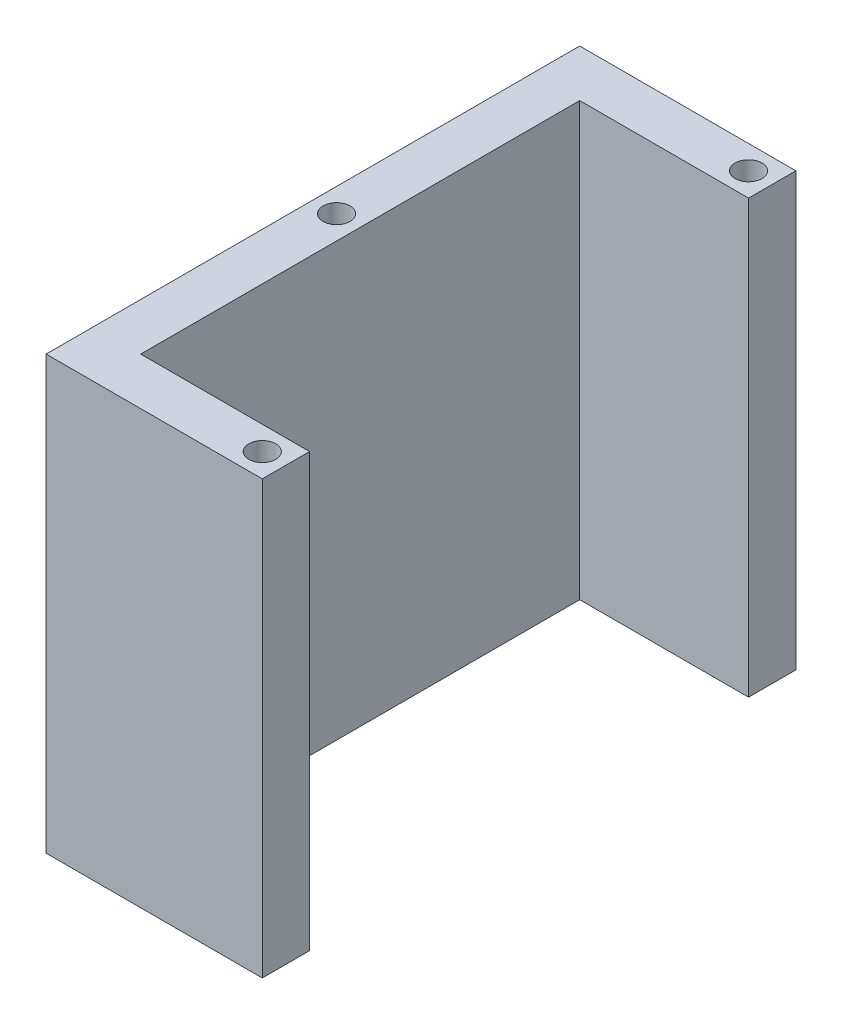
ISO-10303-21;
HEADER;
FILE_DESCRIPTION(('STEP AP214'),'2;1');
FILE_NAME('part.step','',(''),(''),'','','');
FILE_SCHEMA(('AUTOMOTIVE_DESIGN { 1 0 10303 214 1 1 1 1 }'));
ENDSEC;
DATA;
#1=APPLICATION_CONTEXT('core data for automotive mechanical design processes');
#2=APPLICATION_PROTOCOL_DEFINITION('international standard','automotive_design',2000,#1);
#3=PRODUCT_CONTEXT('',#1,'mechanical');
#4=PRODUCT('Part','Part','',(#3));
#5=PRODUCT_RELATED_PRODUCT_CATEGORY('part','',(#4));
#6=PRODUCT_DEFINITION_FORMATION('','',#4);
#7=PRODUCT_DEFINITION_CONTEXT('part definition',#1,'design');
#8=PRODUCT_DEFINITION('design','',#6,#7);
#9=PRODUCT_DEFINITION_SHAPE('','',#8);
#10=(LENGTH_UNIT() NAMED_UNIT(*) SI_UNIT(.MILLI.,.METRE.));
#11=(NAMED_UNIT(*) PLANE_ANGLE_UNIT() SI_UNIT($,.RADIAN.));
#12=(NAMED_UNIT(*) SI_UNIT($,.STERADIAN.) SOLID_ANGLE_UNIT());
#13=UNCERTAINTY_MEASURE_WITH_UNIT(LENGTH_MEASURE(1.E-05),#10,'distance_accuracy_value','');
#14=(GEOMETRIC_REPRESENTATION_CONTEXT(3) GLOBAL_UNCERTAINTY_ASSIGNED_CONTEXT((#13)) GLOBAL_UNIT_ASSIGNED_CONTEXT((#10,
#11,#12)) REPRESENTATION_CONTEXT('',''));
#15=CARTESIAN_POINT('',(0.,0.,0.));
#16=DIRECTION('',(0.,0.,1.));
#17=DIRECTION('',(1.,0.,0.));
#18=AXIS2_PLACEMENT_3D('',#15,#16,#17);
#19=CARTESIAN_POINT('',(12.5,64.,0.));
#20=DIRECTION('',(1.,0.,0.));
#21=DIRECTION('',(0.,0.,-1.));
#22=AXIS2_PLACEMENT_3D('',#19,#20,#21);
#23=PLANE('',#22);
#24=DIRECTION('',(0.,0.,1.));
#25=VECTOR('',#24,1.);
#26=CARTESIAN_POINT('',(12.5,0.,0.));
#27=LINE('',#26,#25);
#28=CARTESIAN_POINT('',(12.5,0.,32.5));
#29=VERTEX_POINT('',#28);
#30=CARTESIAN_POINT('',(12.5,0.,39.5));
#31=VERTEX_POINT('',#30);
#32=EDGE_CURVE('E130',#29,#31,#27,.T.);
#33=ORIENTED_EDGE('',*,*,#32,.F.);
#34=DIRECTION('',(0.,-1.,0.));
#35=VECTOR('',#34,1.);
#36=CARTESIAN_POINT('',(12.5,64.,32.5));
#37=LINE('',#36,#35);
#38=CARTESIAN_POINT('',(12.5,64.,32.5));
#39=VERTEX_POINT('',#38);
#40=EDGE_CURVE('E11',#39,#29,#37,.T.);
#41=ORIENTED_EDGE('',*,*,#40,.F.);
#42=DIRECTION('',(0.,0.,1.));
#43=VECTOR('',#42,1.);
#44=CARTESIAN_POINT('',(12.5,64.,0.));
#45=LINE('',#44,#43);
#46=CARTESIAN_POINT('',(12.5,64.,39.5));
#47=VERTEX_POINT('',#46);
#48=EDGE_CURVE('E149',#39,#47,#45,.T.);
#49=ORIENTED_EDGE('',*,*,#48,.T.);
#50=DIRECTION('',(0.,-1.,0.));
#51=VECTOR('',#50,1.);
#52=CARTESIAN_POINT('',(12.5,64.,39.5));
#53=LINE('',#52,#51);
#54=EDGE_CURVE('E88',#47,#31,#53,.T.);
#55=ORIENTED_EDGE('',*,*,#54,.T.);
#56=EDGE_LOOP('',(#33,#41,#49,#55));
#57=FACE_BOUND('',#56,.T.);
#58=ADVANCED_FACE('F38',(#57),#23,.T.);
#59=CARTESIAN_POINT('',(0.,64.,32.5));
#60=DIRECTION('',(0.,0.,-1.));
#61=DIRECTION('',(-1.,0.,0.));
#62=AXIS2_PLACEMENT_3D('',#59,#60,#61);
#63=PLANE('',#62);
#64=DIRECTION('',(1.,0.,0.));
#65=VECTOR('',#64,1.);
#66=CARTESIAN_POINT('',(0.,0.,32.5));
#67=LINE('',#66,#65);
#68=CARTESIAN_POINT('',(-12.5,0.,32.5));
#69=VERTEX_POINT('',#68);
#70=EDGE_CURVE('E133',#69,#29,#67,.T.);
#71=ORIENTED_EDGE('',*,*,#70,.F.);
#72=DIRECTION('',(0.,-1.,0.));
#73=VECTOR('',#72,1.);
#74=CARTESIAN_POINT('',(-12.5,64.,32.5));
#75=LINE('',#74,#73);
#76=CARTESIAN_POINT('',(-12.5,64.,32.5));
#77=VERTEX_POINT('',#76);
#78=EDGE_CURVE('E46',#77,#69,#75,.T.);
#79=ORIENTED_EDGE('',*,*,#78,.F.);
#80=DIRECTION('',(1.,0.,0.));
#81=VECTOR('',#80,1.);
#82=CARTESIAN_POINT('',(0.,64.,32.5));
#83=LINE('',#82,#81);
#84=EDGE_CURVE('E173',#77,#39,#83,.T.);
#85=ORIENTED_EDGE('',*,*,#84,.T.);
#86=ORIENTED_EDGE('',*,*,#40,.T.);
#87=EDGE_LOOP('',(#71,#79,#85,#86));
#88=FACE_BOUND('',#87,.T.);
#89=ADVANCED_FACE('F172',(#88),#63,.T.);
#90=CARTESIAN_POINT('',(-12.5,64.,0.));
#91=DIRECTION('',(-1.,0.,0.));
#92=DIRECTION('',(0.,0.,1.));
#93=AXIS2_PLACEMENT_3D('',#90,#91,#92);
#94=PLANE('',#93);
#95=DIRECTION('',(0.,0.,-1.));
#96=VECTOR('',#95,1.);
#97=CARTESIAN_POINT('',(-12.5,0.,0.));
#98=LINE('',#97,#96);
#99=CARTESIAN_POINT('',(-12.5,0.,-32.5));
#100=VERTEX_POINT('',#99);
#101=EDGE_CURVE('E137',#69,#100,#98,.T.);
#102=ORIENTED_EDGE('',*,*,#101,.T.);
#103=DIRECTION('',(0.,-1.,0.));
#104=VECTOR('',#103,1.);
#105=CARTESIAN_POINT('',(-12.5,64.,-32.5));
#106=LINE('',#105,#104);
#107=CARTESIAN_POINT('',(-12.5,64.,-32.5));
#108=VERTEX_POINT('',#107);
#109=EDGE_CURVE('E156',#108,#100,#106,.T.);
#110=ORIENTED_EDGE('',*,*,#109,.F.);
#111=DIRECTION('',(0.,0.,-1.));
#112=VECTOR('',#111,1.);
#113=CARTESIAN_POINT('',(-12.5,64.,0.));
#114=LINE('',#113,#112);
#115=EDGE_CURVE('E163',#77,#108,#114,.T.);
#116=ORIENTED_EDGE('',*,*,#115,.F.);
#117=ORIENTED_EDGE('',*,*,#78,.T.);
#118=EDGE_LOOP('',(#102,#110,#116,#117));
#119=FACE_BOUND('',#118,.T.);
#120=ADVANCED_FACE('F161',(#119),#94,.F.);
#121=CARTESIAN_POINT('',(0.,64.,-32.5));
#122=DIRECTION('',(0.,0.,-1.));
#123=DIRECTION('',(-1.,0.,0.));
#124=AXIS2_PLACEMENT_3D('',#121,#122,#123);
#125=PLANE('',#124);
#126=DIRECTION('',(1.,0.,0.));
#127=VECTOR('',#126,1.);
#128=CARTESIAN_POINT('',(0.,0.,-32.5));
#129=LINE('',#128,#127);
#130=CARTESIAN_POINT('',(12.5,0.,-32.5));
#131=VERTEX_POINT('',#130);
#132=EDGE_CURVE('E139',#100,#131,#129,.T.);
#133=ORIENTED_EDGE('',*,*,#132,.T.);
#134=DIRECTION('',(0.,-1.,0.));
#135=VECTOR('',#134,1.);
#136=CARTESIAN_POINT('',(12.5,64.,-32.5));
#137=LINE('',#136,#135);
#138=CARTESIAN_POINT('',(12.5,64.,-32.5));
#139=VERTEX_POINT('',#138);
#140=EDGE_CURVE('E153',#139,#131,#137,.T.);
#141=ORIENTED_EDGE('',*,*,#140,.F.);
#142=DIRECTION('',(1.,0.,0.));
#143=VECTOR('',#142,1.);
#144=CARTESIAN_POINT('',(0.,64.,-32.5));
#145=LINE('',#144,#143);
#146=EDGE_CURVE('E182',#108,#139,#145,.T.);
#147=ORIENTED_EDGE('',*,*,#146,.F.);
#148=ORIENTED_EDGE('',*,*,#109,.T.);
#149=EDGE_LOOP('',(#133,#141,#147,#148));
#150=FACE_BOUND('',#149,.T.);
#151=ADVANCED_FACE('F186',(#150),#125,.F.);
#152=CARTESIAN_POINT('',(12.5,64.,0.));
#153=DIRECTION('',(-1.,0.,0.));
#154=DIRECTION('',(0.,0.,1.));
#155=AXIS2_PLACEMENT_3D('',#152,#153,#154);
#156=PLANE('',#155);
#157=DIRECTION('',(0.,0.,-1.));
#158=VECTOR('',#157,1.);
#159=CARTESIAN_POINT('',(12.5,0.,0.));
#160=LINE('',#159,#158);
#161=CARTESIAN_POINT('',(12.5,0.,-39.5));
#162=VERTEX_POINT('',#161);
#163=EDGE_CURVE('E141',#131,#162,#160,.T.);
#164=ORIENTED_EDGE('',*,*,#163,.T.);
#165=DIRECTION('',(0.,-1.,0.));
#166=VECTOR('',#165,1.);
#167=CARTESIAN_POINT('',(12.5,64.,-39.5));
#168=LINE('',#167,#166);
#169=CARTESIAN_POINT('',(12.5,64.,-39.5));
#170=VERTEX_POINT('',#169);
#171=EDGE_CURVE('E117',#170,#162,#168,.T.);
#172=ORIENTED_EDGE('',*,*,#171,.F.);
#173=DIRECTION('',(0.,0.,-1.));
#174=VECTOR('',#173,1.);
#175=CARTESIAN_POINT('',(12.5,64.,0.));
#176=LINE('',#175,#174);
#177=EDGE_CURVE('E122',#139,#170,#176,.T.);
#178=ORIENTED_EDGE('',*,*,#177,.F.);
#179=ORIENTED_EDGE('',*,*,#140,.T.);
#180=EDGE_LOOP('',(#164,#172,#178,#179));
#181=FACE_BOUND('',#180,.T.);
#182=ADVANCED_FACE('F188',(#181),#156,.F.);
#183=CARTESIAN_POINT('',(0.,64.,-39.5));
#184=DIRECTION('',(0.,0.,-1.));
#185=DIRECTION('',(-1.,0.,0.));
#186=AXIS2_PLACEMENT_3D('',#183,#184,#185);
#187=PLANE('',#186);
#188=DIRECTION('',(1.,0.,0.));
#189=VECTOR('',#188,1.);
#190=CARTESIAN_POINT('',(0.,0.,-39.5));
#191=LINE('',#190,#189);
#192=CARTESIAN_POINT('',(-19.5,0.,-39.5));
#193=VERTEX_POINT('',#192);
#194=EDGE_CURVE('E112',#193,#162,#191,.T.);
#195=ORIENTED_EDGE('',*,*,#194,.F.);
#196=DIRECTION('',(0.,-1.,0.));
#197=VECTOR('',#196,1.);
#198=CARTESIAN_POINT('',(-19.5,64.,-39.5));
#199=LINE('',#198,#197);
#200=CARTESIAN_POINT('',(-19.5,64.,-39.5));
#201=VERTEX_POINT('',#200);
#202=EDGE_CURVE('E107',#201,#193,#199,.T.);
#203=ORIENTED_EDGE('',*,*,#202,.F.);
#204=DIRECTION('',(1.,0.,0.));
#205=VECTOR('',#204,1.);
#206=CARTESIAN_POINT('',(0.,64.,-39.5));
#207=LINE('',#206,#205);
#208=EDGE_CURVE('E110',#201,#170,#207,.T.);
#209=ORIENTED_EDGE('',*,*,#208,.T.);
#210=ORIENTED_EDGE('',*,*,#171,.T.);
#211=EDGE_LOOP('',(#195,#203,#209,#210));
#212=FACE_BOUND('',#211,.T.);
#213=ADVANCED_FACE('F109',(#212),#187,.T.);
#214=CARTESIAN_POINT('',(-19.5,64.,0.));
#215=DIRECTION('',(-1.,0.,0.));
#216=DIRECTION('',(0.,0.,1.));
#217=AXIS2_PLACEMENT_3D('',#214,#215,#216);
#218=PLANE('',#217);
#219=DIRECTION('',(0.,0.,-1.));
#220=VECTOR('',#219,1.);
#221=CARTESIAN_POINT('',(-19.5,0.,0.));
#222=LINE('',#221,#220);
#223=CARTESIAN_POINT('',(-19.5,0.,39.5));
#224=VERTEX_POINT('',#223);
#225=EDGE_CURVE('E145',#224,#193,#222,.T.);
#226=ORIENTED_EDGE('',*,*,#225,.F.);
#227=DIRECTION('',(0.,-1.,0.));
#228=VECTOR('',#227,1.);
#229=CARTESIAN_POINT('',(-19.5,64.,39.5));
#230=LINE('',#229,#228);
#231=CARTESIAN_POINT('',(-19.5,64.,39.5));
#232=VERTEX_POINT('',#231);
#233=EDGE_CURVE('E81',#232,#224,#230,.T.);
#234=ORIENTED_EDGE('',*,*,#233,.F.);
#235=DIRECTION('',(0.,0.,-1.));
#236=VECTOR('',#235,1.);
#237=CARTESIAN_POINT('',(-19.5,64.,0.));
#238=LINE('',#237,#236);
#239=EDGE_CURVE('E120',#232,#201,#238,.T.);
#240=ORIENTED_EDGE('',*,*,#239,.T.);
#241=ORIENTED_EDGE('',*,*,#202,.T.);
#242=EDGE_LOOP('',(#226,#234,#240,#241));
#243=FACE_BOUND('',#242,.T.);
#244=ADVANCED_FACE('F125',(#243),#218,.T.);
#245=CARTESIAN_POINT('',(0.,64.,39.5));
#246=DIRECTION('',(0.,0.,-1.));
#247=DIRECTION('',(-1.,0.,0.));
#248=AXIS2_PLACEMENT_3D('',#245,#246,#247);
#249=PLANE('',#248);
#250=DIRECTION('',(1.,0.,0.));
#251=VECTOR('',#250,1.);
#252=CARTESIAN_POINT('',(0.,0.,39.5));
#253=LINE('',#252,#251);
#254=EDGE_CURVE('E147',#224,#31,#253,.T.);
#255=ORIENTED_EDGE('',*,*,#254,.T.);
#256=ORIENTED_EDGE('',*,*,#54,.F.);
#257=DIRECTION('',(1.,0.,0.));
#258=VECTOR('',#257,1.);
#259=CARTESIAN_POINT('',(0.,64.,39.5));
#260=LINE('',#259,#258);
#261=EDGE_CURVE('E54',#232,#47,#260,.T.);
#262=ORIENTED_EDGE('',*,*,#261,.F.);
#263=ORIENTED_EDGE('',*,*,#233,.T.);
#264=EDGE_LOOP('',(#255,#256,#262,#263));
#265=FACE_BOUND('',#264,.T.);
#266=ADVANCED_FACE('F174',(#265),#249,.F.);
#267=CARTESIAN_POINT('',(0.,64.,0.));
#268=DIRECTION('',(0.,1.,0.));
#269=DIRECTION('',(0.,0.,1.));
#270=AXIS2_PLACEMENT_3D('',#267,#268,#269);
#271=PLANE('',#270);
#272=CARTESIAN_POINT('',(-16.,64.,0.));
#273=DIRECTION('',(0.,1.,0.));
#274=DIRECTION('',(0.,0.,1.));
#275=AXIS2_PLACEMENT_3D('',#272,#273,#274);
#276=CIRCLE('',#275,2.);
#277=CARTESIAN_POINT('',(-16.,64.,2.));
#278=VERTEX_POINT('',#277);
#279=EDGE_CURVE('E461',#278,#278,#276,.T.);
#280=ORIENTED_EDGE('',*,*,#279,.F.);
#281=EDGE_LOOP('',(#280));
#282=FACE_BOUND('',#281,.T.);
#283=CARTESIAN_POINT('',(9.,64.,36.));
#284=DIRECTION('',(0.,1.,0.));
#285=DIRECTION('',(0.,0.,1.));
#286=AXIS2_PLACEMENT_3D('',#283,#284,#285);
#287=CIRCLE('',#286,2.);
#288=CARTESIAN_POINT('',(9.,64.,38.));
#289=VERTEX_POINT('',#288);
#290=EDGE_CURVE('E467',#289,#289,#287,.T.);
#291=ORIENTED_EDGE('',*,*,#290,.F.);
#292=EDGE_LOOP('',(#291));
#293=FACE_BOUND('',#292,.T.);
#294=CARTESIAN_POINT('',(8.99999999999999,64.,-36.));
#295=DIRECTION('',(0.,1.,0.));
#296=DIRECTION('',(0.,0.,-1.));
#297=AXIS2_PLACEMENT_3D('',#294,#295,#296);
#298=CIRCLE('',#297,2.);
#299=CARTESIAN_POINT('',(8.99999999999999,64.,-38.));
#300=VERTEX_POINT('',#299);
#301=EDGE_CURVE('E475',#300,#300,#298,.T.);
#302=ORIENTED_EDGE('',*,*,#301,.F.);
#303=EDGE_LOOP('',(#302));
#304=FACE_BOUND('',#303,.T.);
#305=ORIENTED_EDGE('',*,*,#48,.F.);
#306=ORIENTED_EDGE('',*,*,#84,.F.);
#307=ORIENTED_EDGE('',*,*,#115,.T.);
#308=ORIENTED_EDGE('',*,*,#146,.T.);
#309=ORIENTED_EDGE('',*,*,#177,.T.);
#310=ORIENTED_EDGE('',*,*,#208,.F.);
#311=ORIENTED_EDGE('',*,*,#239,.F.);
#312=ORIENTED_EDGE('',*,*,#261,.T.);
#313=EDGE_LOOP('',(#305,#306,#307,#308,#309,#310,#311,#312));
#314=FACE_BOUND('',#313,.T.);
#315=ADVANCED_FACE('F119',(#282,#293,#304,#314),#271,.T.);
#316=CARTESIAN_POINT('',(0.,0.,0.));
#317=DIRECTION('',(0.,1.,0.));
#318=DIRECTION('',(0.,0.,1.));
#319=AXIS2_PLACEMENT_3D('',#316,#317,#318);
#320=PLANE('',#319);
#321=CARTESIAN_POINT('',(-16.,0.,36.));
#322=DIRECTION('',(0.,1.,0.));
#323=DIRECTION('',(0.,0.,-1.));
#324=AXIS2_PLACEMENT_3D('',#321,#322,#323);
#325=CIRCLE('',#324,2.);
#326=CARTESIAN_POINT('',(-16.,0.,34.));
#327=VERTEX_POINT('',#326);
#328=EDGE_CURVE('E484',#327,#327,#325,.T.);
#329=ORIENTED_EDGE('',*,*,#328,.T.);
#330=EDGE_LOOP('',(#329));
#331=FACE_BOUND('',#330,.T.);
#332=CARTESIAN_POINT('',(9.,0.,-36.));
#333=DIRECTION('',(0.,1.,0.));
#334=DIRECTION('',(0.,0.,1.));
#335=AXIS2_PLACEMENT_3D('',#332,#333,#334);
#336=CIRCLE('',#335,2.);
#337=CARTESIAN_POINT('',(9.,0.,-34.));
#338=VERTEX_POINT('',#337);
#339=EDGE_CURVE('E490',#338,#338,#336,.T.);
#340=ORIENTED_EDGE('',*,*,#339,.T.);
#341=EDGE_LOOP('',(#340));
#342=FACE_BOUND('',#341,.T.);
#343=CARTESIAN_POINT('',(9.,0.,36.));
#344=DIRECTION('',(0.,1.,0.));
#345=DIRECTION('',(0.,0.,-1.));
#346=AXIS2_PLACEMENT_3D('',#343,#344,#345);
#347=CIRCLE('',#346,2.);
#348=CARTESIAN_POINT('',(9.,0.,34.));
#349=VERTEX_POINT('',#348);
#350=EDGE_CURVE('E464',#349,#349,#347,.T.);
#351=ORIENTED_EDGE('',*,*,#350,.T.);
#352=EDGE_LOOP('',(#351));
#353=FACE_BOUND('',#352,.T.);
#354=CARTESIAN_POINT('',(-16.,0.,-36.));
#355=DIRECTION('',(0.,1.,0.));
#356=DIRECTION('',(0.,0.,1.));
#357=AXIS2_PLACEMENT_3D('',#354,#355,#356);
#358=CIRCLE('',#357,2.);
#359=CARTESIAN_POINT('',(-16.,0.,-34.));
#360=VERTEX_POINT('',#359);
#361=EDGE_CURVE('E178',#360,#360,#358,.T.);
#362=ORIENTED_EDGE('',*,*,#361,.T.);
#363=EDGE_LOOP('',(#362));
#364=FACE_BOUND('',#363,.T.);
#365=ORIENTED_EDGE('',*,*,#32,.T.);
#366=ORIENTED_EDGE('',*,*,#254,.F.);
#367=ORIENTED_EDGE('',*,*,#225,.T.);
#368=ORIENTED_EDGE('',*,*,#194,.T.);
#369=ORIENTED_EDGE('',*,*,#163,.F.);
#370=ORIENTED_EDGE('',*,*,#132,.F.);
#371=ORIENTED_EDGE('',*,*,#101,.F.);
#372=ORIENTED_EDGE('',*,*,#70,.T.);
#373=EDGE_LOOP('',(#365,#366,#367,#368,#369,#370,#371,#372));
#374=FACE_BOUND('',#373,.T.);
#375=ADVANCED_FACE('F170',(#331,#342,#353,#364,#374),#320,.F.);
#376=CARTESIAN_POINT('',(-16.,5.7,-36.));
#377=DIRECTION('',(0.,-1.,0.));
#378=DIRECTION('',(0.,0.,-1.));
#379=AXIS2_PLACEMENT_3D('',#376,#377,#378);
#380=CYLINDRICAL_SURFACE('',#379,2.);
#381=CARTESIAN_POINT('',(-16.,5.7,-36.));
#382=DIRECTION('',(0.,1.,0.));
#383=DIRECTION('',(0.,0.,1.));
#384=AXIS2_PLACEMENT_3D('',#381,#382,#383);
#385=CIRCLE('',#384,2.);
#386=CARTESIAN_POINT('',(-16.,5.7,-34.));
#387=VERTEX_POINT('',#386);
#388=EDGE_CURVE('E134',#387,#387,#385,.T.);
#389=ORIENTED_EDGE('',*,*,#388,.T.);
#390=EDGE_LOOP('',(#389));
#391=FACE_BOUND('',#390,.T.);
#392=ORIENTED_EDGE('',*,*,#361,.F.);
#393=EDGE_LOOP('',(#392));
#394=FACE_BOUND('',#393,.T.);
#395=ADVANCED_FACE('F253',(#391,#394),#380,.F.);
#396=CARTESIAN_POINT('',(-16.,5.7,-36.));
#397=DIRECTION('',(0.,1.,0.));
#398=DIRECTION('',(0.,0.,1.));
#399=AXIS2_PLACEMENT_3D('',#396,#397,#398);
#400=PLANE('',#399);
#401=ORIENTED_EDGE('',*,*,#388,.F.);
#402=EDGE_LOOP('',(#401));
#403=FACE_BOUND('',#402,.T.);
#404=ADVANCED_FACE('F264',(#403),#400,.F.);
#405=CARTESIAN_POINT('',(9.,5.7,36.));
#406=DIRECTION('',(0.,-1.,0.));
#407=DIRECTION('',(0.,0.,-1.));
#408=AXIS2_PLACEMENT_3D('',#405,#406,#407);
#409=CYLINDRICAL_SURFACE('',#408,2.);
#410=CARTESIAN_POINT('',(9.,5.7,36.));
#411=DIRECTION('',(0.,1.,0.));
#412=DIRECTION('',(0.,0.,-1.));
#413=AXIS2_PLACEMENT_3D('',#410,#411,#412);
#414=CIRCLE('',#413,2.);
#415=CARTESIAN_POINT('',(9.,5.7,34.));
#416=VERTEX_POINT('',#415);
#417=EDGE_CURVE('E460',#416,#416,#414,.T.);
#418=ORIENTED_EDGE('',*,*,#417,.T.);
#419=EDGE_LOOP('',(#418));
#420=FACE_BOUND('',#419,.T.);
#421=ORIENTED_EDGE('',*,*,#350,.F.);
#422=EDGE_LOOP('',(#421));
#423=FACE_BOUND('',#422,.T.);
#424=ADVANCED_FACE('F275',(#420,#423),#409,.F.);
#425=CARTESIAN_POINT('',(9.,5.7,36.));
#426=DIRECTION('',(0.,-1.,0.));
#427=DIRECTION('',(0.,0.,-1.));
#428=AXIS2_PLACEMENT_3D('',#425,#426,#427);
#429=PLANE('',#428);
#430=ORIENTED_EDGE('',*,*,#417,.F.);
#431=EDGE_LOOP('',(#430));
#432=FACE_BOUND('',#431,.T.);
#433=ADVANCED_FACE('F286',(#432),#429,.T.);
#434=CARTESIAN_POINT('',(9.,5.7,-36.));
#435=DIRECTION('',(0.,-1.,0.));
#436=DIRECTION('',(0.,0.,-1.));
#437=AXIS2_PLACEMENT_3D('',#434,#435,#436);
#438=CYLINDRICAL_SURFACE('',#437,2.);
#439=CARTESIAN_POINT('',(9.,5.7,-36.));
#440=DIRECTION('',(0.,1.,0.));
#441=DIRECTION('',(0.,0.,1.));
#442=AXIS2_PLACEMENT_3D('',#439,#440,#441);
#443=CIRCLE('',#442,2.);
#444=CARTESIAN_POINT('',(9.,5.7,-34.));
#445=VERTEX_POINT('',#444);
#446=EDGE_CURVE('E482',#445,#445,#443,.T.);
#447=ORIENTED_EDGE('',*,*,#446,.T.);
#448=EDGE_LOOP('',(#447));
#449=FACE_BOUND('',#448,.T.);
#450=ORIENTED_EDGE('',*,*,#339,.F.);
#451=EDGE_LOOP('',(#450));
#452=FACE_BOUND('',#451,.T.);
#453=ADVANCED_FACE('F297',(#449,#452),#438,.F.);
#454=CARTESIAN_POINT('',(9.,5.7,-36.));
#455=DIRECTION('',(0.,1.,0.));
#456=DIRECTION('',(0.,0.,1.));
#457=AXIS2_PLACEMENT_3D('',#454,#455,#456);
#458=PLANE('',#457);
#459=ORIENTED_EDGE('',*,*,#446,.F.);
#460=EDGE_LOOP('',(#459));
#461=FACE_BOUND('',#460,.T.);
#462=ADVANCED_FACE('F308',(#461),#458,.F.);
#463=CARTESIAN_POINT('',(-16.,5.7,36.));
#464=DIRECTION('',(0.,-1.,0.));
#465=DIRECTION('',(0.,0.,-1.));
#466=AXIS2_PLACEMENT_3D('',#463,#464,#465);
#467=CYLINDRICAL_SURFACE('',#466,2.);
#468=CARTESIAN_POINT('',(-16.,5.7,36.));
#469=DIRECTION('',(0.,1.,0.));
#470=DIRECTION('',(0.,0.,-1.));
#471=AXIS2_PLACEMENT_3D('',#468,#469,#470);
#472=CIRCLE('',#471,2.);
#473=CARTESIAN_POINT('',(-16.,5.7,34.));
#474=VERTEX_POINT('',#473);
#475=EDGE_CURVE('E487',#474,#474,#472,.T.);
#476=ORIENTED_EDGE('',*,*,#475,.T.);
#477=EDGE_LOOP('',(#476));
#478=FACE_BOUND('',#477,.T.);
#479=ORIENTED_EDGE('',*,*,#328,.F.);
#480=EDGE_LOOP('',(#479));
#481=FACE_BOUND('',#480,.T.);
#482=ADVANCED_FACE('F319',(#478,#481),#467,.F.);
#483=CARTESIAN_POINT('',(-16.,5.7,36.));
#484=DIRECTION('',(0.,-1.,0.));
#485=DIRECTION('',(0.,0.,-1.));
#486=AXIS2_PLACEMENT_3D('',#483,#484,#485);
#487=PLANE('',#486);
#488=ORIENTED_EDGE('',*,*,#475,.F.);
#489=EDGE_LOOP('',(#488));
#490=FACE_BOUND('',#489,.T.);
#491=ADVANCED_FACE('F330',(#490),#487,.T.);
#492=CARTESIAN_POINT('',(8.99999999999999,58.3,-36.));
#493=DIRECTION('',(0.,1.,0.));
#494=DIRECTION('',(0.,0.,1.));
#495=AXIS2_PLACEMENT_3D('',#492,#493,#494);
#496=CYLINDRICAL_SURFACE('',#495,2.);
#497=CARTESIAN_POINT('',(8.99999999999999,58.3,-36.));
#498=DIRECTION('',(0.,1.,0.));
#499=DIRECTION('',(0.,0.,-1.));
#500=AXIS2_PLACEMENT_3D('',#497,#498,#499);
#501=CIRCLE('',#500,2.);
#502=CARTESIAN_POINT('',(8.99999999999999,58.3,-38.));
#503=VERTEX_POINT('',#502);
#504=EDGE_CURVE('E478',#503,#503,#501,.T.);
#505=ORIENTED_EDGE('',*,*,#504,.F.);
#506=EDGE_LOOP('',(#505));
#507=FACE_BOUND('',#506,.T.);
#508=ORIENTED_EDGE('',*,*,#301,.T.);
#509=EDGE_LOOP('',(#508));
#510=FACE_BOUND('',#509,.T.);
#511=ADVANCED_FACE('F341',(#507,#510),#496,.F.);
#512=CARTESIAN_POINT('',(8.99999999999999,58.3,-36.));
#513=DIRECTION('',(0.,-1.,0.));
#514=DIRECTION('',(0.,0.,-1.));
#515=AXIS2_PLACEMENT_3D('',#512,#513,#514);
#516=PLANE('',#515);
#517=ORIENTED_EDGE('',*,*,#504,.T.);
#518=EDGE_LOOP('',(#517));
#519=FACE_BOUND('',#518,.T.);
#520=ADVANCED_FACE('F360',(#519),#516,.F.);
#521=CARTESIAN_POINT('',(9.,58.3,36.));
#522=DIRECTION('',(0.,1.,0.));
#523=DIRECTION('',(0.,0.,1.));
#524=AXIS2_PLACEMENT_3D('',#521,#522,#523);
#525=CYLINDRICAL_SURFACE('',#524,2.);
#526=CARTESIAN_POINT('',(9.,58.3,36.));
#527=DIRECTION('',(0.,1.,0.));
#528=DIRECTION('',(0.,0.,1.));
#529=AXIS2_PLACEMENT_3D('',#526,#527,#528);
#530=CIRCLE('',#529,2.);
#531=CARTESIAN_POINT('',(9.,58.3,38.));
#532=VERTEX_POINT('',#531);
#533=EDGE_CURVE('E472',#532,#532,#530,.T.);
#534=ORIENTED_EDGE('',*,*,#533,.F.);
#535=EDGE_LOOP('',(#534));
#536=FACE_BOUND('',#535,.T.);
#537=ORIENTED_EDGE('',*,*,#290,.T.);
#538=EDGE_LOOP('',(#537));
#539=FACE_BOUND('',#538,.T.);
#540=ADVANCED_FACE('F371',(#536,#539),#525,.F.);
#541=CARTESIAN_POINT('',(9.,58.3,36.));
#542=DIRECTION('',(0.,1.,0.));
#543=DIRECTION('',(0.,0.,1.));
#544=AXIS2_PLACEMENT_3D('',#541,#542,#543);
#545=PLANE('',#544);
#546=ORIENTED_EDGE('',*,*,#533,.T.);
#547=EDGE_LOOP('',(#546));
#548=FACE_BOUND('',#547,.T.);
#549=ADVANCED_FACE('F382',(#548),#545,.T.);
#550=CARTESIAN_POINT('',(-16.,58.3,0.));
#551=DIRECTION('',(0.,1.,0.));
#552=DIRECTION('',(0.,0.,1.));
#553=AXIS2_PLACEMENT_3D('',#550,#551,#552);
#554=CYLINDRICAL_SURFACE('',#553,2.);
#555=CARTESIAN_POINT('',(-16.,58.3,0.));
#556=DIRECTION('',(0.,1.,0.));
#557=DIRECTION('',(0.,0.,1.));
#558=AXIS2_PLACEMENT_3D('',#555,#556,#557);
#559=CIRCLE('',#558,2.);
#560=CARTESIAN_POINT('',(-16.,58.3,2.));
#561=VERTEX_POINT('',#560);
#562=EDGE_CURVE('E459',#561,#561,#559,.T.);
#563=ORIENTED_EDGE('',*,*,#562,.F.);
#564=EDGE_LOOP('',(#563));
#565=FACE_BOUND('',#564,.T.);
#566=ORIENTED_EDGE('',*,*,#279,.T.);
#567=EDGE_LOOP('',(#566));
#568=FACE_BOUND('',#567,.T.);
#569=ADVANCED_FACE('F393',(#565,#568),#554,.F.);
#570=CARTESIAN_POINT('',(-16.,58.3,0.));
#571=DIRECTION('',(0.,1.,0.));
#572=DIRECTION('',(0.,0.,1.));
#573=AXIS2_PLACEMENT_3D('',#570,#571,#572);
#574=PLANE('',#573);
#575=ORIENTED_EDGE('',*,*,#562,.T.);
#576=EDGE_LOOP('',(#575));
#577=FACE_BOUND('',#576,.T.);
#578=ADVANCED_FACE('F404',(#577),#574,.T.);
#579=CLOSED_SHELL('',(#58,#89,#120,#151,#182,#213,#244,#266,#315,#375,#395,#404,#424,#433,#453,
#462,#482,#491,#511,#520,#540,#549,#569,#578));
#580=MANIFOLD_SOLID_BREP('B2',#579);
#581=ADVANCED_BREP_SHAPE_REPRESENTATION('',(#18,#580),#14);
#582=SHAPE_DEFINITION_REPRESENTATION(#9,#581);
ENDSEC;
END-ISO-10303-21;
